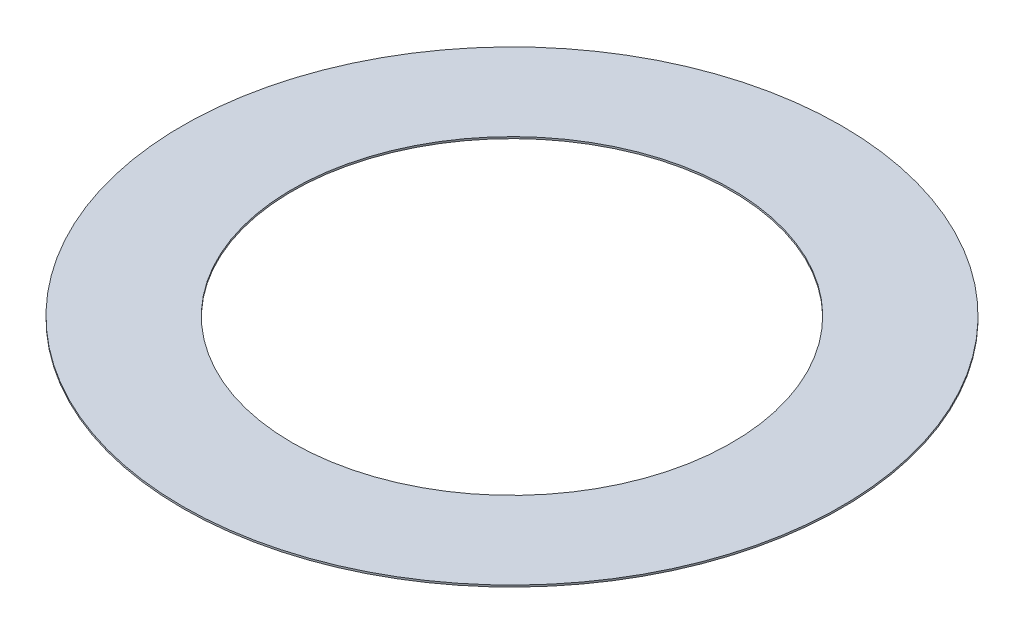
ISO-10303-21;
HEADER;
FILE_DESCRIPTION(('STEP AP214'),'2;1');
FILE_NAME('part.step','',(''),(''),'','','');
FILE_SCHEMA(('AUTOMOTIVE_DESIGN { 1 0 10303 214 1 1 1 1 }'));
ENDSEC;
DATA;
#1=APPLICATION_CONTEXT('core data for automotive mechanical design processes');
#2=APPLICATION_PROTOCOL_DEFINITION('international standard','automotive_design',2000,#1);
#3=PRODUCT_CONTEXT('',#1,'mechanical');
#4=PRODUCT('Part','Part','',(#3));
#5=PRODUCT_RELATED_PRODUCT_CATEGORY('part','',(#4));
#6=PRODUCT_DEFINITION_FORMATION('','',#4);
#7=PRODUCT_DEFINITION_CONTEXT('part definition',#1,'design');
#8=PRODUCT_DEFINITION('design','',#6,#7);
#9=PRODUCT_DEFINITION_SHAPE('','',#8);
#10=(LENGTH_UNIT() NAMED_UNIT(*) SI_UNIT(.MILLI.,.METRE.));
#11=(NAMED_UNIT(*) PLANE_ANGLE_UNIT() SI_UNIT($,.RADIAN.));
#12=(NAMED_UNIT(*) SI_UNIT($,.STERADIAN.) SOLID_ANGLE_UNIT());
#13=UNCERTAINTY_MEASURE_WITH_UNIT(LENGTH_MEASURE(1.E-05),#10,'distance_accuracy_value','');
#14=(GEOMETRIC_REPRESENTATION_CONTEXT(3) GLOBAL_UNCERTAINTY_ASSIGNED_CONTEXT((#13)) GLOBAL_UNIT_ASSIGNED_CONTEXT((#10,
#11,#12)) REPRESENTATION_CONTEXT('',''));
#15=CARTESIAN_POINT('',(0.,0.,0.));
#16=DIRECTION('',(0.,0.,1.));
#17=DIRECTION('',(1.,0.,0.));
#18=AXIS2_PLACEMENT_3D('',#15,#16,#17);
#19=CARTESIAN_POINT('',(0.,0.0254,0.));
#20=DIRECTION('',(0.,1.,0.));
#21=DIRECTION('',(0.,0.,1.));
#22=AXIS2_PLACEMENT_3D('',#19,#20,#21);
#23=PLANE('',#22);
#24=CARTESIAN_POINT('',(0.,0.0254,0.));
#25=DIRECTION('',(0.,1.,0.));
#26=DIRECTION('',(0.,0.,1.));
#27=AXIS2_PLACEMENT_3D('',#24,#25,#26);
#28=CIRCLE('',#27,4.7625);
#29=CARTESIAN_POINT('',(0.,0.0254,4.7625));
#30=VERTEX_POINT('',#29);
#31=EDGE_CURVE('E10',#30,#30,#28,.T.);
#32=ORIENTED_EDGE('',*,*,#31,.T.);
#33=EDGE_LOOP('',(#32));
#34=FACE_BOUND('',#33,.T.);
#35=CARTESIAN_POINT('',(0.,0.0254,0.));
#36=DIRECTION('',(0.,1.,0.));
#37=DIRECTION('',(0.,0.,1.));
#38=AXIS2_PLACEMENT_3D('',#35,#36,#37);
#39=CIRCLE('',#38,3.175);
#40=CARTESIAN_POINT('',(0.,0.0254,3.175));
#41=VERTEX_POINT('',#40);
#42=EDGE_CURVE('E41',#41,#41,#39,.T.);
#43=ORIENTED_EDGE('',*,*,#42,.F.);
#44=EDGE_LOOP('',(#43));
#45=FACE_BOUND('',#44,.T.);
#46=ADVANCED_FACE('F30',(#34,#45),#23,.T.);
#47=CARTESIAN_POINT('',(0.,0.,0.));
#48=DIRECTION('',(0.,1.,0.));
#49=DIRECTION('',(0.,0.,1.));
#50=AXIS2_PLACEMENT_3D('',#47,#48,#49);
#51=PLANE('',#50);
#52=CARTESIAN_POINT('',(0.,0.,0.));
#53=DIRECTION('',(0.,1.,0.));
#54=DIRECTION('',(0.,0.,1.));
#55=AXIS2_PLACEMENT_3D('',#52,#53,#54);
#56=CIRCLE('',#55,4.7625);
#57=CARTESIAN_POINT('',(0.,0.,4.7625));
#58=VERTEX_POINT('',#57);
#59=EDGE_CURVE('E34',#58,#58,#56,.T.);
#60=ORIENTED_EDGE('',*,*,#59,.F.);
#61=EDGE_LOOP('',(#60));
#62=FACE_BOUND('',#61,.T.);
#63=CARTESIAN_POINT('',(0.,0.,0.));
#64=DIRECTION('',(0.,1.,0.));
#65=DIRECTION('',(0.,0.,1.));
#66=AXIS2_PLACEMENT_3D('',#63,#64,#65);
#67=CIRCLE('',#66,3.175);
#68=CARTESIAN_POINT('',(0.,0.,3.175));
#69=VERTEX_POINT('',#68);
#70=EDGE_CURVE('E43',#69,#69,#67,.T.);
#71=ORIENTED_EDGE('',*,*,#70,.T.);
#72=EDGE_LOOP('',(#71));
#73=FACE_BOUND('',#72,.T.);
#74=ADVANCED_FACE('F53',(#62,#73),#51,.F.);
#75=CARTESIAN_POINT('',(0.,0.0254,0.));
#76=DIRECTION('',(0.,-1.,0.));
#77=DIRECTION('',(0.,0.,-1.));
#78=AXIS2_PLACEMENT_3D('',#75,#76,#77);
#79=CYLINDRICAL_SURFACE('',#78,4.7625);
#80=ORIENTED_EDGE('',*,*,#31,.F.);
#81=EDGE_LOOP('',(#80));
#82=FACE_BOUND('',#81,.T.);
#83=ORIENTED_EDGE('',*,*,#59,.T.);
#84=EDGE_LOOP('',(#83));
#85=FACE_BOUND('',#84,.T.);
#86=ADVANCED_FACE('F32',(#82,#85),#79,.T.);
#87=CARTESIAN_POINT('',(0.,0.0254,0.));
#88=DIRECTION('',(0.,-1.,0.));
#89=DIRECTION('',(0.,0.,-1.));
#90=AXIS2_PLACEMENT_3D('',#87,#88,#89);
#91=CYLINDRICAL_SURFACE('',#90,3.175);
#92=ORIENTED_EDGE('',*,*,#42,.T.);
#93=EDGE_LOOP('',(#92));
#94=FACE_BOUND('',#93,.T.);
#95=ORIENTED_EDGE('',*,*,#70,.F.);
#96=EDGE_LOOP('',(#95));
#97=FACE_BOUND('',#96,.T.);
#98=ADVANCED_FACE('F49',(#94,#97),#91,.F.);
#99=CLOSED_SHELL('',(#46,#74,#86,#98));
#100=MANIFOLD_SOLID_BREP('B2',#99);
#101=ADVANCED_BREP_SHAPE_REPRESENTATION('',(#18,#100),#14);
#102=SHAPE_DEFINITION_REPRESENTATION(#9,#101);
ENDSEC;
END-ISO-10303-21;
